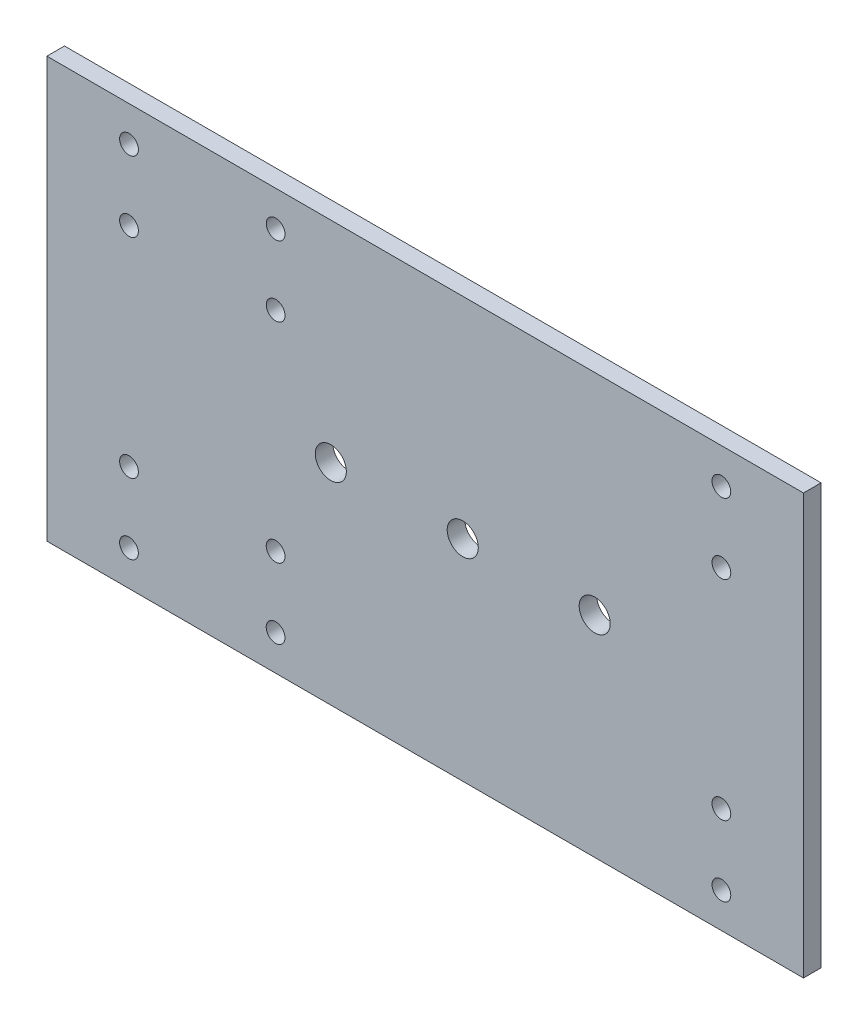
ISO-10303-21;
HEADER;
FILE_DESCRIPTION(('STEP AP214'),'2;1');
FILE_NAME('part.step','',(''),(''),'','','');
FILE_SCHEMA(('AUTOMOTIVE_DESIGN { 1 0 10303 214 1 1 1 1 }'));
ENDSEC;
DATA;
#1=APPLICATION_CONTEXT('core data for automotive mechanical design processes');
#2=APPLICATION_PROTOCOL_DEFINITION('international standard','automotive_design',2000,#1);
#3=PRODUCT_CONTEXT('',#1,'mechanical');
#4=PRODUCT('Part','Part','',(#3));
#5=PRODUCT_RELATED_PRODUCT_CATEGORY('part','',(#4));
#6=PRODUCT_DEFINITION_FORMATION('','',#4);
#7=PRODUCT_DEFINITION_CONTEXT('part definition',#1,'design');
#8=PRODUCT_DEFINITION('design','',#6,#7);
#9=PRODUCT_DEFINITION_SHAPE('','',#8);
#10=(LENGTH_UNIT() NAMED_UNIT(*) SI_UNIT(.MILLI.,.METRE.));
#11=(NAMED_UNIT(*) PLANE_ANGLE_UNIT() SI_UNIT($,.RADIAN.));
#12=(NAMED_UNIT(*) SI_UNIT($,.STERADIAN.) SOLID_ANGLE_UNIT());
#13=UNCERTAINTY_MEASURE_WITH_UNIT(LENGTH_MEASURE(1.E-05),#10,'distance_accuracy_value','');
#14=(GEOMETRIC_REPRESENTATION_CONTEXT(3) GLOBAL_UNCERTAINTY_ASSIGNED_CONTEXT((#13)) GLOBAL_UNIT_ASSIGNED_CONTEXT((#10,
#11,#12)) REPRESENTATION_CONTEXT('',''));
#15=CARTESIAN_POINT('',(0.,0.,0.));
#16=DIRECTION('',(0.,0.,1.));
#17=DIRECTION('',(1.,0.,0.));
#18=AXIS2_PLACEMENT_3D('',#15,#16,#17);
#19=CARTESIAN_POINT('',(0.,0.,3.));
#20=DIRECTION('',(0.,0.,1.));
#21=DIRECTION('',(1.,0.,0.));
#22=AXIS2_PLACEMENT_3D('',#19,#20,#21);
#23=PLANE('',#22);
#24=CARTESIAN_POINT('',(-80.6000000000027,-11.7895095093582,3.));
#25=DIRECTION('',(0.,0.,1.));
#26=DIRECTION('',(1.,0.,0.));
#27=AXIS2_PLACEMENT_3D('',#24,#25,#26);
#28=CIRCLE('',#27,2.65000000000178);
#29=CARTESIAN_POINT('',(-77.9500000000009,-11.7895095093582,3.));
#30=VERTEX_POINT('',#29);
#31=EDGE_CURVE('E198',#30,#30,#28,.T.);
#32=ORIENTED_EDGE('',*,*,#31,.F.);
#33=EDGE_LOOP('',(#32));
#34=FACE_BOUND('',#33,.T.);
#35=CARTESIAN_POINT('',(-35.6000000000027,-11.7895095093582,3.));
#36=DIRECTION('',(0.,0.,1.));
#37=DIRECTION('',(1.,0.,0.));
#38=AXIS2_PLACEMENT_3D('',#35,#36,#37);
#39=CIRCLE('',#38,2.65000000000178);
#40=CARTESIAN_POINT('',(-32.9500000000009,-11.7895095093582,3.));
#41=VERTEX_POINT('',#40);
#42=EDGE_CURVE('E192',#41,#41,#39,.T.);
#43=ORIENTED_EDGE('',*,*,#42,.F.);
#44=EDGE_LOOP('',(#43));
#45=FACE_BOUND('',#44,.T.);
#46=CARTESIAN_POINT('',(-58.1,-11.789509509358,3.));
#47=DIRECTION('',(0.,0.,1.));
#48=DIRECTION('',(1.,0.,0.));
#49=AXIS2_PLACEMENT_3D('',#46,#47,#48);
#50=CIRCLE('',#49,2.65);
#51=CARTESIAN_POINT('',(-55.45,-11.789509509358,3.));
#52=VERTEX_POINT('',#51);
#53=EDGE_CURVE('E186',#52,#52,#50,.T.);
#54=ORIENTED_EDGE('',*,*,#53,.F.);
#55=EDGE_LOOP('',(#54));
#56=FACE_BOUND('',#55,.T.);
#57=CARTESIAN_POINT('',(-115.00577879544,6.01951100932077,3.));
#58=DIRECTION('',(0.,0.,1.));
#59=DIRECTION('',(1.,0.,0.));
#60=AXIS2_PLACEMENT_3D('',#57,#58,#59);
#61=CIRCLE('',#60,1.60000000001785);
#62=CARTESIAN_POINT('',(-113.405778795422,6.01951100932077,3.));
#63=VERTEX_POINT('',#62);
#64=EDGE_CURVE('E171',#63,#63,#61,.T.);
#65=ORIENTED_EDGE('',*,*,#64,.F.);
#66=EDGE_LOOP('',(#65));
#67=FACE_BOUND('',#66,.T.);
#68=CARTESIAN_POINT('',(-115.010777037492,-41.5804887282589,3.));
#69=DIRECTION('',(0.,0.,1.));
#70=DIRECTION('',(1.,0.,0.));
#71=AXIS2_PLACEMENT_3D('',#68,#69,#70);
#72=CIRCLE('',#71,1.60000000001786);
#73=CARTESIAN_POINT('',(-113.410777037474,-41.5804887282589,3.));
#74=VERTEX_POINT('',#73);
#75=EDGE_CURVE('E159',#74,#74,#72,.T.);
#76=ORIENTED_EDGE('',*,*,#75,.F.);
#77=EDGE_LOOP('',(#76));
#78=FACE_BOUND('',#77,.T.);
#79=CARTESIAN_POINT('',(-90.0107771753178,-41.5831138553852,3.));
#80=DIRECTION('',(0.,0.,1.));
#81=DIRECTION('',(1.,0.,0.));
#82=AXIS2_PLACEMENT_3D('',#79,#80,#81);
#83=CIRCLE('',#82,1.60000000001787);
#84=CARTESIAN_POINT('',(-88.4107771753,-41.5831138553852,3.));
#85=VERTEX_POINT('',#84);
#86=EDGE_CURVE('E147',#85,#85,#83,.T.);
#87=ORIENTED_EDGE('',*,*,#86,.F.);
#88=EDGE_LOOP('',(#87));
#89=FACE_BOUND('',#88,.T.);
#90=CARTESIAN_POINT('',(-90.0045188722434,18.016885816038,3.));
#91=DIRECTION('',(0.,0.,1.));
#92=DIRECTION('',(1.,0.,0.));
#93=AXIS2_PLACEMENT_3D('',#90,#91,#92);
#94=CIRCLE('',#93,1.60000000001785);
#95=CARTESIAN_POINT('',(-88.4045188722256,18.016885816038,3.));
#96=VERTEX_POINT('',#95);
#97=EDGE_CURVE('E135',#96,#96,#94,.T.);
#98=ORIENTED_EDGE('',*,*,#97,.F.);
#99=EDGE_LOOP('',(#98));
#100=FACE_BOUND('',#99,.T.);
#101=CARTESIAN_POINT('',(-14.0000000000193,6.00000000000021,3.));
#102=DIRECTION('',(0.,0.,1.));
#103=DIRECTION('',(1.,0.,0.));
#104=AXIS2_PLACEMENT_3D('',#101,#102,#103);
#105=CIRCLE('',#104,1.6);
#106=CARTESIAN_POINT('',(-12.4000000000193,6.00000000000021,3.));
#107=VERTEX_POINT('',#106);
#108=EDGE_CURVE('E123',#107,#107,#105,.T.);
#109=ORIENTED_EDGE('',*,*,#108,.F.);
#110=EDGE_LOOP('',(#109));
#111=FACE_BOUND('',#110,.T.);
#112=CARTESIAN_POINT('',(-14.0000000000166,-29.6000000000001,3.));
#113=DIRECTION('',(0.,0.,1.));
#114=DIRECTION('',(1.,0.,0.));
#115=AXIS2_PLACEMENT_3D('',#112,#113,#114);
#116=CIRCLE('',#115,1.60000000001785);
#117=CARTESIAN_POINT('',(-12.3999999999987,-29.6000000000001,3.));
#118=VERTEX_POINT('',#117);
#119=EDGE_CURVE('E102',#118,#118,#116,.T.);
#120=ORIENTED_EDGE('',*,*,#119,.F.);
#121=EDGE_LOOP('',(#120));
#122=FACE_BOUND('',#121,.T.);
#123=DIRECTION('',(0.,-1.,0.));
#124=VECTOR('',#123,1.);
#125=CARTESIAN_POINT('',(-129.003888626723,24.0209809812841,3.));
#126=LINE('',#125,#124);
#127=CARTESIAN_POINT('',(-129.003888626723,24.0209809812841,3.));
#128=VERTEX_POINT('',#127);
#129=CARTESIAN_POINT('',(-129.003888626723,-47.6000000000002,3.));
#130=VERTEX_POINT('',#129);
#131=EDGE_CURVE('E87',#128,#130,#126,.T.);
#132=ORIENTED_EDGE('',*,*,#131,.T.);
#133=DIRECTION('',(1.,0.,0.));
#134=VECTOR('',#133,1.);
#135=CARTESIAN_POINT('',(-129.003888626723,-47.6000000000002,3.));
#136=LINE('',#135,#134);
#137=CARTESIAN_POINT('',(-9.70257215124773E-12,-47.6000000000002,3.));
#138=VERTEX_POINT('',#137);
#139=EDGE_CURVE('E82',#130,#138,#136,.T.);
#140=ORIENTED_EDGE('',*,*,#139,.T.);
#141=DIRECTION('',(1.35464282201257E-13,1.,0.));
#142=VECTOR('',#141,1.);
#143=CARTESIAN_POINT('',(0.,24.0209809812841,3.));
#144=LINE('',#143,#142);
#145=CARTESIAN_POINT('',(0.,24.0209809812841,3.));
#146=VERTEX_POINT('',#145);
#147=EDGE_CURVE('E85',#138,#146,#144,.T.);
#148=ORIENTED_EDGE('',*,*,#147,.T.);
#149=DIRECTION('',(-1.,0.,0.));
#150=VECTOR('',#149,1.);
#151=CARTESIAN_POINT('',(-129.003888626723,24.0209809812841,3.));
#152=LINE('',#151,#150);
#153=EDGE_CURVE('E52',#146,#128,#152,.T.);
#154=ORIENTED_EDGE('',*,*,#153,.T.);
#155=EDGE_LOOP('',(#132,#140,#148,#154));
#156=FACE_BOUND('',#155,.T.);
#157=CARTESIAN_POINT('',(-14.0000000000166,-41.6000000000001,3.));
#158=DIRECTION('',(0.,0.,1.));
#159=DIRECTION('',(1.,0.,0.));
#160=AXIS2_PLACEMENT_3D('',#157,#158,#159);
#161=CIRCLE('',#160,1.60000000001785);
#162=CARTESIAN_POINT('',(-12.3999999999987,-41.6000000000001,3.));
#163=VERTEX_POINT('',#162);
#164=EDGE_CURVE('E117',#163,#163,#161,.T.);
#165=ORIENTED_EDGE('',*,*,#164,.F.);
#166=EDGE_LOOP('',(#165));
#167=FACE_BOUND('',#166,.T.);
#168=CARTESIAN_POINT('',(-14.0000000000193,18.0000000000002,3.));
#169=DIRECTION('',(0.,0.,1.));
#170=DIRECTION('',(1.,0.,0.));
#171=AXIS2_PLACEMENT_3D('',#168,#169,#170);
#172=CIRCLE('',#171,1.6);
#173=CARTESIAN_POINT('',(-12.4000000000193,18.0000000000002,3.));
#174=VERTEX_POINT('',#173);
#175=EDGE_CURVE('E129',#174,#174,#172,.T.);
#176=ORIENTED_EDGE('',*,*,#175,.F.);
#177=EDGE_LOOP('',(#176));
#178=FACE_BOUND('',#177,.T.);
#179=CARTESIAN_POINT('',(-90.0057789332652,6.01688588219443,3.));
#180=DIRECTION('',(0.,0.,1.));
#181=DIRECTION('',(1.,0.,0.));
#182=AXIS2_PLACEMENT_3D('',#179,#180,#181);
#183=CIRCLE('',#182,1.60000000001785);
#184=CARTESIAN_POINT('',(-88.4057789332473,6.01688588219443,3.));
#185=VERTEX_POINT('',#184);
#186=EDGE_CURVE('E141',#185,#185,#183,.T.);
#187=ORIENTED_EDGE('',*,*,#186,.F.);
#188=EDGE_LOOP('',(#187));
#189=FACE_BOUND('',#188,.T.);
#190=CARTESIAN_POINT('',(-90.0095171142961,-29.5831139215416,3.));
#191=DIRECTION('',(0.,0.,1.));
#192=DIRECTION('',(1.,0.,0.));
#193=AXIS2_PLACEMENT_3D('',#190,#191,#192);
#194=CIRCLE('',#193,1.60000000001785);
#195=CARTESIAN_POINT('',(-88.4095171142783,-29.5831139215416,3.));
#196=VERTEX_POINT('',#195);
#197=EDGE_CURVE('E153',#196,#196,#194,.T.);
#198=ORIENTED_EDGE('',*,*,#197,.F.);
#199=EDGE_LOOP('',(#198));
#200=FACE_BOUND('',#199,.T.);
#201=CARTESIAN_POINT('',(-115.00951697647,-29.5804887944153,3.));
#202=DIRECTION('',(0.,0.,1.));
#203=DIRECTION('',(1.,0.,0.));
#204=AXIS2_PLACEMENT_3D('',#201,#202,#203);
#205=CIRCLE('',#204,1.60000000001785);
#206=CARTESIAN_POINT('',(-113.409516976452,-29.5804887944153,3.));
#207=VERTEX_POINT('',#206);
#208=EDGE_CURVE('E165',#207,#207,#205,.T.);
#209=ORIENTED_EDGE('',*,*,#208,.F.);
#210=EDGE_LOOP('',(#209));
#211=FACE_BOUND('',#210,.T.);
#212=CARTESIAN_POINT('',(-115.004518734418,18.0195109431644,3.));
#213=DIRECTION('',(0.,0.,1.));
#214=DIRECTION('',(1.,0.,0.));
#215=AXIS2_PLACEMENT_3D('',#212,#213,#214);
#216=CIRCLE('',#215,1.60000000001785);
#217=CARTESIAN_POINT('',(-113.4045187344,18.0195109431644,3.));
#218=VERTEX_POINT('',#217);
#219=EDGE_CURVE('E177',#218,#218,#216,.T.);
#220=ORIENTED_EDGE('',*,*,#219,.F.);
#221=EDGE_LOOP('',(#220));
#222=FACE_BOUND('',#221,.T.);
#223=ADVANCED_FACE('F35',(#34,#45,#56,#67,#78,#89,#100,#111,#122,#156,#167,#178,#189,#200,#211,
#222),#23,.T.);
#224=CARTESIAN_POINT('',(0.,0.,0.));
#225=DIRECTION('',(0.,0.,1.));
#226=DIRECTION('',(1.,0.,0.));
#227=AXIS2_PLACEMENT_3D('',#224,#225,#226);
#228=PLANE('',#227);
#229=CARTESIAN_POINT('',(-80.6000000000027,-11.7895095093582,0.));
#230=DIRECTION('',(0.,0.,1.));
#231=DIRECTION('',(1.,0.,0.));
#232=AXIS2_PLACEMENT_3D('',#229,#230,#231);
#233=CIRCLE('',#232,2.65000000000178);
#234=CARTESIAN_POINT('',(-77.9500000000009,-11.7895095093582,0.));
#235=VERTEX_POINT('',#234);
#236=EDGE_CURVE('E189',#235,#235,#233,.T.);
#237=ORIENTED_EDGE('',*,*,#236,.T.);
#238=EDGE_LOOP('',(#237));
#239=FACE_BOUND('',#238,.T.);
#240=CARTESIAN_POINT('',(-35.6000000000027,-11.7895095093582,0.));
#241=DIRECTION('',(0.,0.,1.));
#242=DIRECTION('',(1.,0.,0.));
#243=AXIS2_PLACEMENT_3D('',#240,#241,#242);
#244=CIRCLE('',#243,2.65000000000178);
#245=CARTESIAN_POINT('',(-32.9500000000009,-11.7895095093582,0.));
#246=VERTEX_POINT('',#245);
#247=EDGE_CURVE('E195',#246,#246,#244,.T.);
#248=ORIENTED_EDGE('',*,*,#247,.T.);
#249=EDGE_LOOP('',(#248));
#250=FACE_BOUND('',#249,.T.);
#251=CARTESIAN_POINT('',(-58.1,-11.789509509358,0.));
#252=DIRECTION('',(0.,0.,1.));
#253=DIRECTION('',(1.,0.,0.));
#254=AXIS2_PLACEMENT_3D('',#251,#252,#253);
#255=CIRCLE('',#254,2.65);
#256=CARTESIAN_POINT('',(-55.45,-11.789509509358,0.));
#257=VERTEX_POINT('',#256);
#258=EDGE_CURVE('E183',#257,#257,#255,.T.);
#259=ORIENTED_EDGE('',*,*,#258,.T.);
#260=EDGE_LOOP('',(#259));
#261=FACE_BOUND('',#260,.T.);
#262=DIRECTION('',(0.,-1.,0.));
#263=VECTOR('',#262,1.);
#264=CARTESIAN_POINT('',(-129.003888626723,24.0209809812841,0.));
#265=LINE('',#264,#263);
#266=CARTESIAN_POINT('',(-129.003888626723,24.0209809812841,0.));
#267=VERTEX_POINT('',#266);
#268=CARTESIAN_POINT('',(-129.003888626723,-47.6000000000002,0.));
#269=VERTEX_POINT('',#268);
#270=EDGE_CURVE('E99',#267,#269,#265,.T.);
#271=ORIENTED_EDGE('',*,*,#270,.F.);
#272=DIRECTION('',(-1.,0.,0.));
#273=VECTOR('',#272,1.);
#274=CARTESIAN_POINT('',(-129.003888626723,24.0209809812841,0.));
#275=LINE('',#274,#273);
#276=CARTESIAN_POINT('',(0.,24.0209809812841,0.));
#277=VERTEX_POINT('',#276);
#278=EDGE_CURVE('E75',#277,#267,#275,.T.);
#279=ORIENTED_EDGE('',*,*,#278,.F.);
#280=DIRECTION('',(1.35464282201257E-13,1.,0.));
#281=VECTOR('',#280,1.);
#282=CARTESIAN_POINT('',(0.,24.0209809812841,0.));
#283=LINE('',#282,#281);
#284=CARTESIAN_POINT('',(-9.70257215124773E-12,-47.6000000000002,0.));
#285=VERTEX_POINT('',#284);
#286=EDGE_CURVE('E69',#285,#277,#283,.T.);
#287=ORIENTED_EDGE('',*,*,#286,.F.);
#288=DIRECTION('',(1.,0.,0.));
#289=VECTOR('',#288,1.);
#290=CARTESIAN_POINT('',(-129.003888626723,-47.6000000000002,0.));
#291=LINE('',#290,#289);
#292=EDGE_CURVE('E91',#269,#285,#291,.T.);
#293=ORIENTED_EDGE('',*,*,#292,.F.);
#294=EDGE_LOOP('',(#271,#279,#287,#293));
#295=FACE_BOUND('',#294,.T.);
#296=CARTESIAN_POINT('',(-14.0000000000166,-29.6000000000001,0.));
#297=DIRECTION('',(0.,0.,1.));
#298=DIRECTION('',(1.,0.,0.));
#299=AXIS2_PLACEMENT_3D('',#296,#297,#298);
#300=CIRCLE('',#299,1.60000000001785);
#301=CARTESIAN_POINT('',(-12.3999999999987,-29.6000000000001,0.));
#302=VERTEX_POINT('',#301);
#303=EDGE_CURVE('E114',#302,#302,#300,.T.);
#304=ORIENTED_EDGE('',*,*,#303,.T.);
#305=EDGE_LOOP('',(#304));
#306=FACE_BOUND('',#305,.T.);
#307=CARTESIAN_POINT('',(-14.0000000000166,-41.6000000000001,0.));
#308=DIRECTION('',(0.,0.,1.));
#309=DIRECTION('',(1.,0.,0.));
#310=AXIS2_PLACEMENT_3D('',#307,#308,#309);
#311=CIRCLE('',#310,1.60000000001785);
#312=CARTESIAN_POINT('',(-12.3999999999987,-41.6000000000001,0.));
#313=VERTEX_POINT('',#312);
#314=EDGE_CURVE('E120',#313,#313,#311,.T.);
#315=ORIENTED_EDGE('',*,*,#314,.T.);
#316=EDGE_LOOP('',(#315));
#317=FACE_BOUND('',#316,.T.);
#318=CARTESIAN_POINT('',(-14.0000000000193,6.00000000000021,0.));
#319=DIRECTION('',(0.,0.,1.));
#320=DIRECTION('',(1.,0.,0.));
#321=AXIS2_PLACEMENT_3D('',#318,#319,#320);
#322=CIRCLE('',#321,1.6);
#323=CARTESIAN_POINT('',(-12.4000000000193,6.00000000000021,0.));
#324=VERTEX_POINT('',#323);
#325=EDGE_CURVE('E126',#324,#324,#322,.T.);
#326=ORIENTED_EDGE('',*,*,#325,.T.);
#327=EDGE_LOOP('',(#326));
#328=FACE_BOUND('',#327,.T.);
#329=CARTESIAN_POINT('',(-14.0000000000193,18.0000000000002,0.));
#330=DIRECTION('',(0.,0.,1.));
#331=DIRECTION('',(1.,0.,0.));
#332=AXIS2_PLACEMENT_3D('',#329,#330,#331);
#333=CIRCLE('',#332,1.6);
#334=CARTESIAN_POINT('',(-12.4000000000193,18.0000000000002,0.));
#335=VERTEX_POINT('',#334);
#336=EDGE_CURVE('E132',#335,#335,#333,.T.);
#337=ORIENTED_EDGE('',*,*,#336,.T.);
#338=EDGE_LOOP('',(#337));
#339=FACE_BOUND('',#338,.T.);
#340=CARTESIAN_POINT('',(-90.0045188722434,18.016885816038,0.));
#341=DIRECTION('',(0.,0.,1.));
#342=DIRECTION('',(1.,0.,0.));
#343=AXIS2_PLACEMENT_3D('',#340,#341,#342);
#344=CIRCLE('',#343,1.60000000001785);
#345=CARTESIAN_POINT('',(-88.4045188722256,18.016885816038,0.));
#346=VERTEX_POINT('',#345);
#347=EDGE_CURVE('E138',#346,#346,#344,.T.);
#348=ORIENTED_EDGE('',*,*,#347,.T.);
#349=EDGE_LOOP('',(#348));
#350=FACE_BOUND('',#349,.T.);
#351=CARTESIAN_POINT('',(-90.0057789332652,6.01688588219443,0.));
#352=DIRECTION('',(0.,0.,1.));
#353=DIRECTION('',(1.,0.,0.));
#354=AXIS2_PLACEMENT_3D('',#351,#352,#353);
#355=CIRCLE('',#354,1.60000000001785);
#356=CARTESIAN_POINT('',(-88.4057789332473,6.01688588219443,0.));
#357=VERTEX_POINT('',#356);
#358=EDGE_CURVE('E144',#357,#357,#355,.T.);
#359=ORIENTED_EDGE('',*,*,#358,.T.);
#360=EDGE_LOOP('',(#359));
#361=FACE_BOUND('',#360,.T.);
#362=CARTESIAN_POINT('',(-90.0107771753178,-41.5831138553852,0.));
#363=DIRECTION('',(0.,0.,1.));
#364=DIRECTION('',(1.,0.,0.));
#365=AXIS2_PLACEMENT_3D('',#362,#363,#364);
#366=CIRCLE('',#365,1.60000000001787);
#367=CARTESIAN_POINT('',(-88.4107771753,-41.5831138553852,0.));
#368=VERTEX_POINT('',#367);
#369=EDGE_CURVE('E150',#368,#368,#366,.T.);
#370=ORIENTED_EDGE('',*,*,#369,.T.);
#371=EDGE_LOOP('',(#370));
#372=FACE_BOUND('',#371,.T.);
#373=CARTESIAN_POINT('',(-90.0095171142961,-29.5831139215416,0.));
#374=DIRECTION('',(0.,0.,1.));
#375=DIRECTION('',(1.,0.,0.));
#376=AXIS2_PLACEMENT_3D('',#373,#374,#375);
#377=CIRCLE('',#376,1.60000000001785);
#378=CARTESIAN_POINT('',(-88.4095171142783,-29.5831139215416,0.));
#379=VERTEX_POINT('',#378);
#380=EDGE_CURVE('E156',#379,#379,#377,.T.);
#381=ORIENTED_EDGE('',*,*,#380,.T.);
#382=EDGE_LOOP('',(#381));
#383=FACE_BOUND('',#382,.T.);
#384=CARTESIAN_POINT('',(-115.010777037492,-41.5804887282589,0.));
#385=DIRECTION('',(0.,0.,1.));
#386=DIRECTION('',(1.,0.,0.));
#387=AXIS2_PLACEMENT_3D('',#384,#385,#386);
#388=CIRCLE('',#387,1.60000000001786);
#389=CARTESIAN_POINT('',(-113.410777037474,-41.5804887282589,0.));
#390=VERTEX_POINT('',#389);
#391=EDGE_CURVE('E162',#390,#390,#388,.T.);
#392=ORIENTED_EDGE('',*,*,#391,.T.);
#393=EDGE_LOOP('',(#392));
#394=FACE_BOUND('',#393,.T.);
#395=CARTESIAN_POINT('',(-115.00951697647,-29.5804887944153,0.));
#396=DIRECTION('',(0.,0.,1.));
#397=DIRECTION('',(1.,0.,0.));
#398=AXIS2_PLACEMENT_3D('',#395,#396,#397);
#399=CIRCLE('',#398,1.60000000001785);
#400=CARTESIAN_POINT('',(-113.409516976452,-29.5804887944153,0.));
#401=VERTEX_POINT('',#400);
#402=EDGE_CURVE('E168',#401,#401,#399,.T.);
#403=ORIENTED_EDGE('',*,*,#402,.T.);
#404=EDGE_LOOP('',(#403));
#405=FACE_BOUND('',#404,.T.);
#406=CARTESIAN_POINT('',(-115.00577879544,6.01951100932077,0.));
#407=DIRECTION('',(0.,0.,1.));
#408=DIRECTION('',(1.,0.,0.));
#409=AXIS2_PLACEMENT_3D('',#406,#407,#408);
#410=CIRCLE('',#409,1.60000000001785);
#411=CARTESIAN_POINT('',(-113.405778795422,6.01951100932077,0.));
#412=VERTEX_POINT('',#411);
#413=EDGE_CURVE('E174',#412,#412,#410,.T.);
#414=ORIENTED_EDGE('',*,*,#413,.T.);
#415=EDGE_LOOP('',(#414));
#416=FACE_BOUND('',#415,.T.);
#417=CARTESIAN_POINT('',(-115.004518734418,18.0195109431644,0.));
#418=DIRECTION('',(0.,0.,1.));
#419=DIRECTION('',(1.,0.,0.));
#420=AXIS2_PLACEMENT_3D('',#417,#418,#419);
#421=CIRCLE('',#420,1.60000000001785);
#422=CARTESIAN_POINT('',(-113.4045187344,18.0195109431644,0.));
#423=VERTEX_POINT('',#422);
#424=EDGE_CURVE('E180',#423,#423,#421,.T.);
#425=ORIENTED_EDGE('',*,*,#424,.T.);
#426=EDGE_LOOP('',(#425));
#427=FACE_BOUND('',#426,.T.);
#428=ADVANCED_FACE('F110',(#239,#250,#261,#295,#306,#317,#328,#339,#350,#361,#372,#383,#394,
#405,#416,#427),#228,.F.);
#429=CARTESIAN_POINT('',(-129.003888626723,24.0209809812841,3.));
#430=DIRECTION('',(1.,0.,0.));
#431=DIRECTION('',(0.,0.,-1.));
#432=AXIS2_PLACEMENT_3D('',#429,#430,#431);
#433=PLANE('',#432);
#434=ORIENTED_EDGE('',*,*,#270,.T.);
#435=DIRECTION('',(0.,0.,-1.));
#436=VECTOR('',#435,1.);
#437=CARTESIAN_POINT('',(-129.003888626723,-47.6000000000002,3.));
#438=LINE('',#437,#436);
#439=EDGE_CURVE('E11',#130,#269,#438,.T.);
#440=ORIENTED_EDGE('',*,*,#439,.F.);
#441=ORIENTED_EDGE('',*,*,#131,.F.);
#442=DIRECTION('',(0.,0.,-1.));
#443=VECTOR('',#442,1.);
#444=CARTESIAN_POINT('',(-129.003888626723,24.0209809812841,3.));
#445=LINE('',#444,#443);
#446=EDGE_CURVE('E95',#128,#267,#445,.T.);
#447=ORIENTED_EDGE('',*,*,#446,.T.);
#448=EDGE_LOOP('',(#434,#440,#441,#447));
#449=FACE_BOUND('',#448,.T.);
#450=ADVANCED_FACE('F37',(#449),#433,.F.);
#451=CARTESIAN_POINT('',(-129.003888626723,-47.6000000000002,3.));
#452=DIRECTION('',(0.,1.,0.));
#453=DIRECTION('',(0.,0.,1.));
#454=AXIS2_PLACEMENT_3D('',#451,#452,#453);
#455=PLANE('',#454);
#456=ORIENTED_EDGE('',*,*,#292,.T.);
#457=DIRECTION('',(0.,0.,-1.));
#458=VECTOR('',#457,1.);
#459=CARTESIAN_POINT('',(-9.70257215124773E-12,-47.6000000000002,3.));
#460=LINE('',#459,#458);
#461=EDGE_CURVE('E44',#138,#285,#460,.T.);
#462=ORIENTED_EDGE('',*,*,#461,.F.);
#463=ORIENTED_EDGE('',*,*,#139,.F.);
#464=ORIENTED_EDGE('',*,*,#439,.T.);
#465=EDGE_LOOP('',(#456,#462,#463,#464));
#466=FACE_BOUND('',#465,.T.);
#467=ADVANCED_FACE('F90',(#466),#455,.F.);
#468=CARTESIAN_POINT('',(0.,24.0209809812841,3.));
#469=DIRECTION('',(-1.,1.35464282201257E-13,0.));
#470=DIRECTION('',(-1.35464282201257E-13,-1.,0.));
#471=AXIS2_PLACEMENT_3D('',#468,#469,#470);
#472=PLANE('',#471);
#473=ORIENTED_EDGE('',*,*,#286,.T.);
#474=DIRECTION('',(0.,0.,-1.));
#475=VECTOR('',#474,1.);
#476=CARTESIAN_POINT('',(0.,24.0209809812841,3.));
#477=LINE('',#476,#475);
#478=EDGE_CURVE('E92',#146,#277,#477,.T.);
#479=ORIENTED_EDGE('',*,*,#478,.F.);
#480=ORIENTED_EDGE('',*,*,#147,.F.);
#481=ORIENTED_EDGE('',*,*,#461,.T.);
#482=EDGE_LOOP('',(#473,#479,#480,#481));
#483=FACE_BOUND('',#482,.T.);
#484=ADVANCED_FACE('F93',(#483),#472,.F.);
#485=CARTESIAN_POINT('',(-129.003888626723,24.0209809812841,3.));
#486=DIRECTION('',(0.,-1.,0.));
#487=DIRECTION('',(0.,0.,-1.));
#488=AXIS2_PLACEMENT_3D('',#485,#486,#487);
#489=PLANE('',#488);
#490=ORIENTED_EDGE('',*,*,#278,.T.);
#491=ORIENTED_EDGE('',*,*,#446,.F.);
#492=ORIENTED_EDGE('',*,*,#153,.F.);
#493=ORIENTED_EDGE('',*,*,#478,.T.);
#494=EDGE_LOOP('',(#490,#491,#492,#493));
#495=FACE_BOUND('',#494,.T.);
#496=ADVANCED_FACE('F107',(#495),#489,.F.);
#497=CARTESIAN_POINT('',(-14.0000000000166,-29.6000000000001,3.));
#498=DIRECTION('',(0.,0.,-1.));
#499=DIRECTION('',(-1.,0.,0.));
#500=AXIS2_PLACEMENT_3D('',#497,#498,#499);
#501=CYLINDRICAL_SURFACE('',#500,1.60000000001785);
#502=ORIENTED_EDGE('',*,*,#119,.T.);
#503=EDGE_LOOP('',(#502));
#504=FACE_BOUND('',#503,.T.);
#505=ORIENTED_EDGE('',*,*,#303,.F.);
#506=EDGE_LOOP('',(#505));
#507=FACE_BOUND('',#506,.T.);
#508=ADVANCED_FACE('F232',(#504,#507),#501,.F.);
#509=CARTESIAN_POINT('',(-14.0000000000166,-41.6000000000001,3.));
#510=DIRECTION('',(0.,0.,-1.));
#511=DIRECTION('',(-1.,0.,0.));
#512=AXIS2_PLACEMENT_3D('',#509,#510,#511);
#513=CYLINDRICAL_SURFACE('',#512,1.60000000001785);
#514=ORIENTED_EDGE('',*,*,#164,.T.);
#515=EDGE_LOOP('',(#514));
#516=FACE_BOUND('',#515,.T.);
#517=ORIENTED_EDGE('',*,*,#314,.F.);
#518=EDGE_LOOP('',(#517));
#519=FACE_BOUND('',#518,.T.);
#520=ADVANCED_FACE('F235',(#516,#519),#513,.F.);
#521=CARTESIAN_POINT('',(-14.0000000000193,6.00000000000021,3.));
#522=DIRECTION('',(0.,0.,-1.));
#523=DIRECTION('',(-1.,0.,0.));
#524=AXIS2_PLACEMENT_3D('',#521,#522,#523);
#525=CYLINDRICAL_SURFACE('',#524,1.6);
#526=ORIENTED_EDGE('',*,*,#108,.T.);
#527=EDGE_LOOP('',(#526));
#528=FACE_BOUND('',#527,.T.);
#529=ORIENTED_EDGE('',*,*,#325,.F.);
#530=EDGE_LOOP('',(#529));
#531=FACE_BOUND('',#530,.T.);
#532=ADVANCED_FACE('F306',(#528,#531),#525,.F.);
#533=CARTESIAN_POINT('',(-14.0000000000193,18.0000000000002,3.));
#534=DIRECTION('',(0.,0.,-1.));
#535=DIRECTION('',(-1.,0.,0.));
#536=AXIS2_PLACEMENT_3D('',#533,#534,#535);
#537=CYLINDRICAL_SURFACE('',#536,1.6);
#538=ORIENTED_EDGE('',*,*,#175,.T.);
#539=EDGE_LOOP('',(#538));
#540=FACE_BOUND('',#539,.T.);
#541=ORIENTED_EDGE('',*,*,#336,.F.);
#542=EDGE_LOOP('',(#541));
#543=FACE_BOUND('',#542,.T.);
#544=ADVANCED_FACE('F302',(#540,#543),#537,.F.);
#545=CARTESIAN_POINT('',(-90.0045188722434,18.016885816038,3.));
#546=DIRECTION('',(0.,0.,-1.));
#547=DIRECTION('',(-1.,0.,0.));
#548=AXIS2_PLACEMENT_3D('',#545,#546,#547);
#549=CYLINDRICAL_SURFACE('',#548,1.60000000001785);
#550=ORIENTED_EDGE('',*,*,#97,.T.);
#551=EDGE_LOOP('',(#550));
#552=FACE_BOUND('',#551,.T.);
#553=ORIENTED_EDGE('',*,*,#347,.F.);
#554=EDGE_LOOP('',(#553));
#555=FACE_BOUND('',#554,.T.);
#556=ADVANCED_FACE('F298',(#552,#555),#549,.F.);
#557=CARTESIAN_POINT('',(-90.0057789332652,6.01688588219443,3.));
#558=DIRECTION('',(0.,0.,-1.));
#559=DIRECTION('',(-1.,0.,0.));
#560=AXIS2_PLACEMENT_3D('',#557,#558,#559);
#561=CYLINDRICAL_SURFACE('',#560,1.60000000001785);
#562=ORIENTED_EDGE('',*,*,#186,.T.);
#563=EDGE_LOOP('',(#562));
#564=FACE_BOUND('',#563,.T.);
#565=ORIENTED_EDGE('',*,*,#358,.F.);
#566=EDGE_LOOP('',(#565));
#567=FACE_BOUND('',#566,.T.);
#568=ADVANCED_FACE('F294',(#564,#567),#561,.F.);
#569=CARTESIAN_POINT('',(-90.0107771753178,-41.5831138553852,3.));
#570=DIRECTION('',(0.,0.,-1.));
#571=DIRECTION('',(-1.,0.,0.));
#572=AXIS2_PLACEMENT_3D('',#569,#570,#571);
#573=CYLINDRICAL_SURFACE('',#572,1.60000000001787);
#574=ORIENTED_EDGE('',*,*,#86,.T.);
#575=EDGE_LOOP('',(#574));
#576=FACE_BOUND('',#575,.T.);
#577=ORIENTED_EDGE('',*,*,#369,.F.);
#578=EDGE_LOOP('',(#577));
#579=FACE_BOUND('',#578,.T.);
#580=ADVANCED_FACE('F290',(#576,#579),#573,.F.);
#581=CARTESIAN_POINT('',(-90.0095171142961,-29.5831139215416,3.));
#582=DIRECTION('',(0.,0.,-1.));
#583=DIRECTION('',(-1.,0.,0.));
#584=AXIS2_PLACEMENT_3D('',#581,#582,#583);
#585=CYLINDRICAL_SURFACE('',#584,1.60000000001785);
#586=ORIENTED_EDGE('',*,*,#197,.T.);
#587=EDGE_LOOP('',(#586));
#588=FACE_BOUND('',#587,.T.);
#589=ORIENTED_EDGE('',*,*,#380,.F.);
#590=EDGE_LOOP('',(#589));
#591=FACE_BOUND('',#590,.T.);
#592=ADVANCED_FACE('F286',(#588,#591),#585,.F.);
#593=CARTESIAN_POINT('',(-115.010777037492,-41.5804887282589,3.));
#594=DIRECTION('',(0.,0.,-1.));
#595=DIRECTION('',(-1.,0.,0.));
#596=AXIS2_PLACEMENT_3D('',#593,#594,#595);
#597=CYLINDRICAL_SURFACE('',#596,1.60000000001786);
#598=ORIENTED_EDGE('',*,*,#75,.T.);
#599=EDGE_LOOP('',(#598));
#600=FACE_BOUND('',#599,.T.);
#601=ORIENTED_EDGE('',*,*,#391,.F.);
#602=EDGE_LOOP('',(#601));
#603=FACE_BOUND('',#602,.T.);
#604=ADVANCED_FACE('F282',(#600,#603),#597,.F.);
#605=CARTESIAN_POINT('',(-115.00951697647,-29.5804887944153,3.));
#606=DIRECTION('',(0.,0.,-1.));
#607=DIRECTION('',(-1.,0.,0.));
#608=AXIS2_PLACEMENT_3D('',#605,#606,#607);
#609=CYLINDRICAL_SURFACE('',#608,1.60000000001785);
#610=ORIENTED_EDGE('',*,*,#208,.T.);
#611=EDGE_LOOP('',(#610));
#612=FACE_BOUND('',#611,.T.);
#613=ORIENTED_EDGE('',*,*,#402,.F.);
#614=EDGE_LOOP('',(#613));
#615=FACE_BOUND('',#614,.T.);
#616=ADVANCED_FACE('F275',(#612,#615),#609,.F.);
#617=CARTESIAN_POINT('',(-115.00577879544,6.01951100932077,3.));
#618=DIRECTION('',(0.,0.,-1.));
#619=DIRECTION('',(-1.,0.,0.));
#620=AXIS2_PLACEMENT_3D('',#617,#618,#619);
#621=CYLINDRICAL_SURFACE('',#620,1.60000000001785);
#622=ORIENTED_EDGE('',*,*,#64,.T.);
#623=EDGE_LOOP('',(#622));
#624=FACE_BOUND('',#623,.T.);
#625=ORIENTED_EDGE('',*,*,#413,.F.);
#626=EDGE_LOOP('',(#625));
#627=FACE_BOUND('',#626,.T.);
#628=ADVANCED_FACE('F266',(#624,#627),#621,.F.);
#629=CARTESIAN_POINT('',(-115.004518734418,18.0195109431644,3.));
#630=DIRECTION('',(0.,0.,-1.));
#631=DIRECTION('',(-1.,0.,0.));
#632=AXIS2_PLACEMENT_3D('',#629,#630,#631);
#633=CYLINDRICAL_SURFACE('',#632,1.60000000001785);
#634=ORIENTED_EDGE('',*,*,#219,.T.);
#635=EDGE_LOOP('',(#634));
#636=FACE_BOUND('',#635,.T.);
#637=ORIENTED_EDGE('',*,*,#424,.F.);
#638=EDGE_LOOP('',(#637));
#639=FACE_BOUND('',#638,.T.);
#640=ADVANCED_FACE('F263',(#636,#639),#633,.F.);
#641=CARTESIAN_POINT('',(-58.1,-11.789509509358,0.));
#642=DIRECTION('',(0.,0.,1.));
#643=DIRECTION('',(1.,0.,0.));
#644=AXIS2_PLACEMENT_3D('',#641,#642,#643);
#645=CYLINDRICAL_SURFACE('',#644,2.65);
#646=ORIENTED_EDGE('',*,*,#258,.F.);
#647=EDGE_LOOP('',(#646));
#648=FACE_BOUND('',#647,.T.);
#649=ORIENTED_EDGE('',*,*,#53,.T.);
#650=EDGE_LOOP('',(#649));
#651=FACE_BOUND('',#650,.T.);
#652=ADVANCED_FACE('F265',(#648,#651),#645,.F.);
#653=CARTESIAN_POINT('',(-35.6000000000027,-11.7895095093582,0.));
#654=DIRECTION('',(0.,0.,1.));
#655=DIRECTION('',(1.,0.,0.));
#656=AXIS2_PLACEMENT_3D('',#653,#654,#655);
#657=CYLINDRICAL_SURFACE('',#656,2.65000000000178);
#658=ORIENTED_EDGE('',*,*,#247,.F.);
#659=EDGE_LOOP('',(#658));
#660=FACE_BOUND('',#659,.T.);
#661=ORIENTED_EDGE('',*,*,#42,.T.);
#662=EDGE_LOOP('',(#661));
#663=FACE_BOUND('',#662,.T.);
#664=ADVANCED_FACE('F209',(#660,#663),#657,.F.);
#665=CARTESIAN_POINT('',(-80.6000000000027,-11.7895095093582,0.));
#666=DIRECTION('',(0.,0.,1.));
#667=DIRECTION('',(1.,0.,0.));
#668=AXIS2_PLACEMENT_3D('',#665,#666,#667);
#669=CYLINDRICAL_SURFACE('',#668,2.65000000000178);
#670=ORIENTED_EDGE('',*,*,#236,.F.);
#671=EDGE_LOOP('',(#670));
#672=FACE_BOUND('',#671,.T.);
#673=ORIENTED_EDGE('',*,*,#31,.T.);
#674=EDGE_LOOP('',(#673));
#675=FACE_BOUND('',#674,.T.);
#676=ADVANCED_FACE('F206',(#672,#675),#669,.F.);
#677=CLOSED_SHELL('',(#223,#428,#450,#467,#484,#496,#508,#520,#532,#544,#556,#568,#580,#592,
#604,#616,#628,#640,#652,#664,#676));
#678=MANIFOLD_SOLID_BREP('B2',#677);
#679=ADVANCED_BREP_SHAPE_REPRESENTATION('',(#18,#678),#14);
#680=SHAPE_DEFINITION_REPRESENTATION(#9,#679);
ENDSEC;
END-ISO-10303-21;
